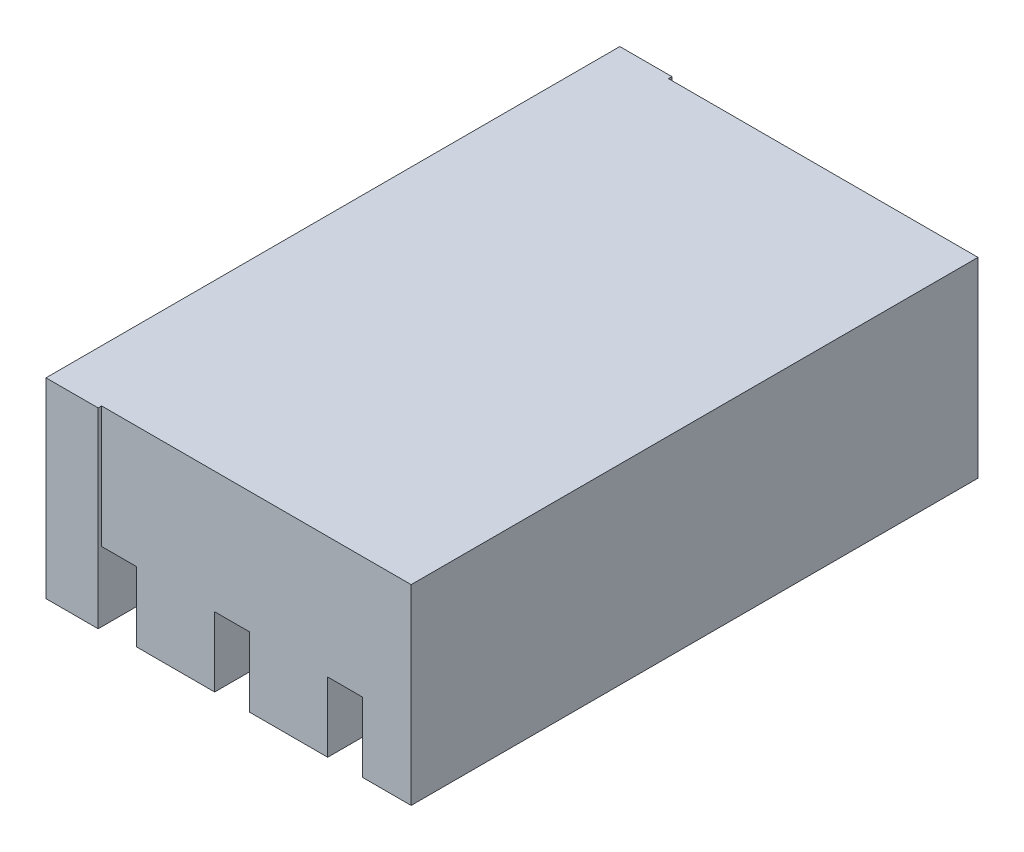
ISO-10303-21;
HEADER;
FILE_DESCRIPTION(('STEP AP214'),'2;1');
FILE_NAME('part.step','',(''),(''),'','','');
FILE_SCHEMA(('AUTOMOTIVE_DESIGN { 1 0 10303 214 1 1 1 1 }'));
ENDSEC;
DATA;
#1=APPLICATION_CONTEXT('core data for automotive mechanical design processes');
#2=APPLICATION_PROTOCOL_DEFINITION('international standard','automotive_design',2000,#1);
#3=PRODUCT_CONTEXT('',#1,'mechanical');
#4=PRODUCT('Part','Part','',(#3));
#5=PRODUCT_RELATED_PRODUCT_CATEGORY('part','',(#4));
#6=PRODUCT_DEFINITION_FORMATION('','',#4);
#7=PRODUCT_DEFINITION_CONTEXT('part definition',#1,'design');
#8=PRODUCT_DEFINITION('design','',#6,#7);
#9=PRODUCT_DEFINITION_SHAPE('','',#8);
#10=(LENGTH_UNIT() NAMED_UNIT(*) SI_UNIT(.MILLI.,.METRE.));
#11=(NAMED_UNIT(*) PLANE_ANGLE_UNIT() SI_UNIT($,.RADIAN.));
#12=(NAMED_UNIT(*) SI_UNIT($,.STERADIAN.) SOLID_ANGLE_UNIT());
#13=UNCERTAINTY_MEASURE_WITH_UNIT(LENGTH_MEASURE(1.E-05),#10,'distance_accuracy_value','');
#14=(GEOMETRIC_REPRESENTATION_CONTEXT(3) GLOBAL_UNCERTAINTY_ASSIGNED_CONTEXT((#13)) GLOBAL_UNIT_ASSIGNED_CONTEXT((#10,
#11,#12)) REPRESENTATION_CONTEXT('',''));
#15=CARTESIAN_POINT('',(0.,0.,0.));
#16=DIRECTION('',(0.,0.,1.));
#17=DIRECTION('',(1.,0.,0.));
#18=AXIS2_PLACEMENT_3D('',#15,#16,#17);
#19=CARTESIAN_POINT('',(0.,0.,0.));
#20=DIRECTION('',(0.,1.,0.));
#21=DIRECTION('',(0.,0.,1.));
#22=AXIS2_PLACEMENT_3D('',#19,#20,#21);
#23=PLANE('',#22);
#24=DIRECTION('',(1.,0.,0.));
#25=VECTOR('',#24,1.);
#26=CARTESIAN_POINT('',(0.,0.,17.8));
#27=LINE('',#26,#25);
#28=CARTESIAN_POINT('',(-5.5,0.,17.8));
#29=VERTEX_POINT('',#28);
#30=CARTESIAN_POINT('',(-1.,0.,17.8));
#31=VERTEX_POINT('',#30);
#32=EDGE_CURVE('E386',#29,#31,#27,.T.);
#33=ORIENTED_EDGE('',*,*,#32,.F.);
#34=DIRECTION('',(0.,0.,1.));
#35=VECTOR('',#34,1.);
#36=CARTESIAN_POINT('',(-5.5,0.,15.));
#37=LINE('',#36,#35);
#38=CARTESIAN_POINT('',(-5.5,0.,15.2));
#39=VERTEX_POINT('',#38);
#40=EDGE_CURVE('E167',#39,#29,#37,.T.);
#41=ORIENTED_EDGE('',*,*,#40,.F.);
#42=DIRECTION('',(-1.,0.,0.));
#43=VECTOR('',#42,1.);
#44=CARTESIAN_POINT('',(0.,0.,15.2));
#45=LINE('',#44,#43);
#46=CARTESIAN_POINT('',(-1.,0.,15.2));
#47=VERTEX_POINT('',#46);
#48=EDGE_CURVE('E284',#47,#39,#45,.T.);
#49=ORIENTED_EDGE('',*,*,#48,.F.);
#50=DIRECTION('',(0.,0.,1.));
#51=VECTOR('',#50,1.);
#52=CARTESIAN_POINT('',(-0.999999999999998,0.,0.));
#53=LINE('',#52,#51);
#54=EDGE_CURVE('E131',#47,#31,#53,.T.);
#55=ORIENTED_EDGE('',*,*,#54,.T.);
#56=EDGE_LOOP('',(#33,#41,#49,#55));
#57=FACE_BOUND('',#56,.T.);
#58=ADVANCED_FACE('F45',(#57),#23,.F.);
#59=DIRECTION('',(-1.,0.,0.));
#60=VECTOR('',#59,1.);
#61=CARTESIAN_POINT('',(0.,0.,-14.8));
#62=LINE('',#61,#60);
#63=CARTESIAN_POINT('',(10.3,0.,-14.8));
#64=VERTEX_POINT('',#63);
#65=CARTESIAN_POINT('',(7.7,0.,-14.8));
#66=VERTEX_POINT('',#65);
#67=EDGE_CURVE('E391',#64,#66,#62,.T.);
#68=ORIENTED_EDGE('',*,*,#67,.F.);
#69=DIRECTION('',(0.,0.,-1.));
#70=VECTOR('',#69,1.);
#71=CARTESIAN_POINT('',(10.3,0.,0.));
#72=LINE('',#71,#70);
#73=CARTESIAN_POINT('',(10.3,0.,17.8));
#74=VERTEX_POINT('',#73);
#75=EDGE_CURVE('E262',#74,#64,#72,.T.);
#76=ORIENTED_EDGE('',*,*,#75,.F.);
#77=DIRECTION('',(1.,0.,0.));
#78=VECTOR('',#77,1.);
#79=CARTESIAN_POINT('',(0.,0.,17.8));
#80=LINE('',#79,#78);
#81=CARTESIAN_POINT('',(7.50000000000001,0.,17.8));
#82=VERTEX_POINT('',#81);
#83=EDGE_CURVE('E259',#82,#74,#80,.T.);
#84=ORIENTED_EDGE('',*,*,#83,.F.);
#85=DIRECTION('',(0.,0.,1.));
#86=VECTOR('',#85,1.);
#87=CARTESIAN_POINT('',(7.5,0.,0.));
#88=LINE('',#87,#86);
#89=CARTESIAN_POINT('',(7.50000000000001,0.,15.2));
#90=VERTEX_POINT('',#89);
#91=EDGE_CURVE('E97',#90,#82,#88,.T.);
#92=ORIENTED_EDGE('',*,*,#91,.F.);
#93=CARTESIAN_POINT('',(7.7,0.,15.2));
#94=VERTEX_POINT('',#93);
#95=EDGE_CURVE('E256',#94,#90,#45,.T.);
#96=ORIENTED_EDGE('',*,*,#95,.F.);
#97=DIRECTION('',(0.,0.,1.));
#98=VECTOR('',#97,1.);
#99=CARTESIAN_POINT('',(7.7,0.,0.));
#100=LINE('',#99,#98);
#101=EDGE_CURVE('E273',#66,#94,#100,.T.);
#102=ORIENTED_EDGE('',*,*,#101,.F.);
#103=EDGE_LOOP('',(#68,#76,#84,#92,#96,#102));
#104=FACE_BOUND('',#103,.T.);
#105=ADVANCED_FACE('F254',(#104),#23,.F.);
#106=CARTESIAN_POINT('',(7.5,11.,0.));
#107=DIRECTION('',(1.,0.,0.));
#108=DIRECTION('',(0.,0.,-1.));
#109=AXIS2_PLACEMENT_3D('',#106,#107,#108);
#110=PLANE('',#109);
#111=DIRECTION('',(0.,-1.,0.));
#112=VECTOR('',#111,1.);
#113=CARTESIAN_POINT('',(7.50000000000001,11.,17.8));
#114=LINE('',#113,#112);
#115=CARTESIAN_POINT('',(7.5,4.,17.8));
#116=VERTEX_POINT('',#115);
#117=EDGE_CURVE('E271',#116,#82,#114,.T.);
#118=ORIENTED_EDGE('',*,*,#117,.F.);
#119=DIRECTION('',(0.,0.,1.));
#120=VECTOR('',#119,1.);
#121=CARTESIAN_POINT('',(7.5,4.,15.));
#122=LINE('',#121,#120);
#123=CARTESIAN_POINT('',(7.5,4.,15.2));
#124=VERTEX_POINT('',#123);
#125=EDGE_CURVE('E181',#124,#116,#122,.T.);
#126=ORIENTED_EDGE('',*,*,#125,.F.);
#127=DIRECTION('',(0.,-1.,0.));
#128=VECTOR('',#127,1.);
#129=CARTESIAN_POINT('',(7.50000000000001,11.,15.2));
#130=LINE('',#129,#128);
#131=EDGE_CURVE('E189',#124,#90,#130,.T.);
#132=ORIENTED_EDGE('',*,*,#131,.T.);
#133=ORIENTED_EDGE('',*,*,#91,.T.);
#134=EDGE_LOOP('',(#118,#126,#132,#133));
#135=FACE_BOUND('',#134,.T.);
#136=ADVANCED_FACE('F242',(#135),#110,.F.);
#137=CARTESIAN_POINT('',(0.,11.,18.));
#138=DIRECTION('',(0.,0.,1.));
#139=DIRECTION('',(1.,0.,0.));
#140=AXIS2_PLACEMENT_3D('',#137,#138,#139);
#141=PLANE('',#140);
#142=DIRECTION('',(0.,-1.,0.));
#143=VECTOR('',#142,1.);
#144=CARTESIAN_POINT('',(-7.5,11.,18.));
#145=LINE('',#144,#143);
#146=CARTESIAN_POINT('',(-7.5,11.,18.));
#147=VERTEX_POINT('',#146);
#148=CARTESIAN_POINT('',(-7.5,0.,18.));
#149=VERTEX_POINT('',#148);
#150=EDGE_CURVE('E159',#147,#149,#145,.T.);
#151=ORIENTED_EDGE('',*,*,#150,.F.);
#152=DIRECTION('',(-1.,0.,0.));
#153=VECTOR('',#152,1.);
#154=CARTESIAN_POINT('',(0.,11.,18.));
#155=LINE('',#154,#153);
#156=CARTESIAN_POINT('',(-10.5,11.,18.));
#157=VERTEX_POINT('',#156);
#158=EDGE_CURVE('E70',#147,#157,#155,.T.);
#159=ORIENTED_EDGE('',*,*,#158,.T.);
#160=DIRECTION('',(0.,-1.,0.));
#161=VECTOR('',#160,1.);
#162=CARTESIAN_POINT('',(-10.5,11.,18.));
#163=LINE('',#162,#161);
#164=CARTESIAN_POINT('',(-10.5,0.,18.));
#165=VERTEX_POINT('',#164);
#166=EDGE_CURVE('E100',#157,#165,#163,.T.);
#167=ORIENTED_EDGE('',*,*,#166,.T.);
#168=DIRECTION('',(-1.,0.,0.));
#169=VECTOR('',#168,1.);
#170=CARTESIAN_POINT('',(0.,0.,18.));
#171=LINE('',#170,#169);
#172=EDGE_CURVE('E88',#149,#165,#171,.T.);
#173=ORIENTED_EDGE('',*,*,#172,.F.);
#174=EDGE_LOOP('',(#151,#159,#167,#173));
#175=FACE_BOUND('',#174,.T.);
#176=ADVANCED_FACE('F101',(#175),#141,.T.);
#177=CARTESIAN_POINT('',(0.,11.,-15.));
#178=DIRECTION('',(0.,0.,-1.));
#179=DIRECTION('',(-1.,0.,0.));
#180=AXIS2_PLACEMENT_3D('',#177,#178,#179);
#181=PLANE('',#180);
#182=DIRECTION('',(-1.,0.,0.));
#183=VECTOR('',#182,1.);
#184=CARTESIAN_POINT('',(0.,11.,-15.));
#185=LINE('',#184,#183);
#186=CARTESIAN_POINT('',(-7.5,11.,-15.));
#187=VERTEX_POINT('',#186);
#188=CARTESIAN_POINT('',(-10.5,11.,-15.));
#189=VERTEX_POINT('',#188);
#190=EDGE_CURVE('E120',#187,#189,#185,.T.);
#191=ORIENTED_EDGE('',*,*,#190,.F.);
#192=DIRECTION('',(0.,-1.,0.));
#193=VECTOR('',#192,1.);
#194=CARTESIAN_POINT('',(-7.5,11.,-15.));
#195=LINE('',#194,#193);
#196=CARTESIAN_POINT('',(-7.5,0.,-15.));
#197=VERTEX_POINT('',#196);
#198=EDGE_CURVE('E124',#187,#197,#195,.T.);
#199=ORIENTED_EDGE('',*,*,#198,.T.);
#200=DIRECTION('',(-1.,0.,0.));
#201=VECTOR('',#200,1.);
#202=CARTESIAN_POINT('',(0.,0.,-15.));
#203=LINE('',#202,#201);
#204=CARTESIAN_POINT('',(-10.5,0.,-15.));
#205=VERTEX_POINT('',#204);
#206=EDGE_CURVE('E111',#197,#205,#203,.T.);
#207=ORIENTED_EDGE('',*,*,#206,.T.);
#208=DIRECTION('',(0.,-1.,0.));
#209=VECTOR('',#208,1.);
#210=CARTESIAN_POINT('',(-10.5,11.,-15.));
#211=LINE('',#210,#209);
#212=EDGE_CURVE('E105',#189,#205,#211,.T.);
#213=ORIENTED_EDGE('',*,*,#212,.F.);
#214=EDGE_LOOP('',(#191,#199,#207,#213));
#215=FACE_BOUND('',#214,.T.);
#216=ADVANCED_FACE('F484',(#215),#181,.T.);
#217=CARTESIAN_POINT('',(0.,11.,0.));
#218=DIRECTION('',(0.,1.,0.));
#219=DIRECTION('',(0.,0.,1.));
#220=AXIS2_PLACEMENT_3D('',#217,#218,#219);
#221=PLANE('',#220);
#222=ORIENTED_EDGE('',*,*,#158,.F.);
#223=DIRECTION('',(0.,0.,1.));
#224=VECTOR('',#223,1.);
#225=CARTESIAN_POINT('',(-7.5,11.,0.));
#226=LINE('',#225,#224);
#227=CARTESIAN_POINT('',(-7.49999999999999,11.,17.8));
#228=VERTEX_POINT('',#227);
#229=EDGE_CURVE('E209',#228,#147,#226,.T.);
#230=ORIENTED_EDGE('',*,*,#229,.F.);
#231=DIRECTION('',(-1.,0.,0.));
#232=VECTOR('',#231,1.);
#233=CARTESIAN_POINT('',(0.,11.,17.8));
#234=LINE('',#233,#232);
#235=CARTESIAN_POINT('',(10.3,11.,17.8));
#236=VERTEX_POINT('',#235);
#237=EDGE_CURVE('E413',#236,#228,#234,.T.);
#238=ORIENTED_EDGE('',*,*,#237,.F.);
#239=DIRECTION('',(0.,0.,1.));
#240=VECTOR('',#239,1.);
#241=CARTESIAN_POINT('',(10.3,11.,0.));
#242=LINE('',#241,#240);
#243=CARTESIAN_POINT('',(10.3,11.,-14.8));
#244=VERTEX_POINT('',#243);
#245=EDGE_CURVE('E400',#244,#236,#242,.T.);
#246=ORIENTED_EDGE('',*,*,#245,.F.);
#247=DIRECTION('',(1.,0.,0.));
#248=VECTOR('',#247,1.);
#249=CARTESIAN_POINT('',(0.,11.,-14.8));
#250=LINE('',#249,#248);
#251=CARTESIAN_POINT('',(-7.5,11.,-14.8));
#252=VERTEX_POINT('',#251);
#253=EDGE_CURVE('E210',#252,#244,#250,.T.);
#254=ORIENTED_EDGE('',*,*,#253,.F.);
#255=EDGE_CURVE('E207',#187,#252,#226,.T.);
#256=ORIENTED_EDGE('',*,*,#255,.F.);
#257=ORIENTED_EDGE('',*,*,#190,.T.);
#258=DIRECTION('',(0.,0.,1.));
#259=VECTOR('',#258,1.);
#260=CARTESIAN_POINT('',(-10.5,11.,0.));
#261=LINE('',#260,#259);
#262=EDGE_CURVE('E198',#189,#157,#261,.T.);
#263=ORIENTED_EDGE('',*,*,#262,.T.);
#264=EDGE_LOOP('',(#222,#230,#238,#246,#254,#256,#257,#263));
#265=FACE_BOUND('',#264,.T.);
#266=ADVANCED_FACE('F437',(#265),#221,.T.);
#267=DIRECTION('',(1.,0.,0.));
#268=VECTOR('',#267,1.);
#269=CARTESIAN_POINT('',(0.,0.,17.8));
#270=LINE('',#269,#268);
#271=CARTESIAN_POINT('',(1.,0.,17.8));
#272=VERTEX_POINT('',#271);
#273=CARTESIAN_POINT('',(5.5,0.,17.8));
#274=VERTEX_POINT('',#273);
#275=EDGE_CURVE('E334',#272,#274,#270,.T.);
#276=ORIENTED_EDGE('',*,*,#275,.F.);
#277=DIRECTION('',(0.,0.,1.));
#278=VECTOR('',#277,1.);
#279=CARTESIAN_POINT('',(0.999999999999999,0.,23.3855915472522));
#280=LINE('',#279,#278);
#281=CARTESIAN_POINT('',(1.,0.,15.2));
#282=VERTEX_POINT('',#281);
#283=EDGE_CURVE('E173',#282,#272,#280,.T.);
#284=ORIENTED_EDGE('',*,*,#283,.F.);
#285=CARTESIAN_POINT('',(5.5,0.,15.2));
#286=VERTEX_POINT('',#285);
#287=EDGE_CURVE('E283',#286,#282,#45,.T.);
#288=ORIENTED_EDGE('',*,*,#287,.F.);
#289=DIRECTION('',(0.,0.,1.));
#290=VECTOR('',#289,1.);
#291=CARTESIAN_POINT('',(5.5,0.,0.));
#292=LINE('',#291,#290);
#293=EDGE_CURVE('E127',#286,#274,#292,.T.);
#294=ORIENTED_EDGE('',*,*,#293,.T.);
#295=EDGE_LOOP('',(#276,#284,#288,#294));
#296=FACE_BOUND('',#295,.T.);
#297=ADVANCED_FACE('F369',(#296),#23,.F.);
#298=CARTESIAN_POINT('',(0.,8.,0.));
#299=DIRECTION('',(0.,1.,0.));
#300=DIRECTION('',(0.,0.,1.));
#301=AXIS2_PLACEMENT_3D('',#298,#299,#300);
#302=PLANE('',#301);
#303=DIRECTION('',(0.,0.,1.));
#304=VECTOR('',#303,1.);
#305=CARTESIAN_POINT('',(-7.5,8.,0.));
#306=LINE('',#305,#304);
#307=CARTESIAN_POINT('',(-7.5,8.,-14.8));
#308=VERTEX_POINT('',#307);
#309=CARTESIAN_POINT('',(-7.49999999999999,8.,15.2));
#310=VERTEX_POINT('',#309);
#311=EDGE_CURVE('E164',#308,#310,#306,.T.);
#312=ORIENTED_EDGE('',*,*,#311,.F.);
#313=DIRECTION('',(1.,0.,0.));
#314=VECTOR('',#313,1.);
#315=CARTESIAN_POINT('',(0.,8.,-14.8));
#316=LINE('',#315,#314);
#317=CARTESIAN_POINT('',(7.7,8.,-14.8));
#318=VERTEX_POINT('',#317);
#319=EDGE_CURVE('E282',#308,#318,#316,.T.);
#320=ORIENTED_EDGE('',*,*,#319,.T.);
#321=DIRECTION('',(0.,0.,1.));
#322=VECTOR('',#321,1.);
#323=CARTESIAN_POINT('',(7.7,8.,0.));
#324=LINE('',#323,#322);
#325=CARTESIAN_POINT('',(7.7,8.,15.2));
#326=VERTEX_POINT('',#325);
#327=EDGE_CURVE('E297',#318,#326,#324,.T.);
#328=ORIENTED_EDGE('',*,*,#327,.T.);
#329=DIRECTION('',(-1.,0.,0.));
#330=VECTOR('',#329,1.);
#331=CARTESIAN_POINT('',(0.,8.,15.2));
#332=LINE('',#331,#330);
#333=EDGE_CURVE('E292',#326,#310,#332,.T.);
#334=ORIENTED_EDGE('',*,*,#333,.T.);
#335=EDGE_LOOP('',(#312,#320,#328,#334));
#336=FACE_BOUND('',#335,.T.);
#337=ADVANCED_FACE('F476',(#336),#302,.F.);
#338=CARTESIAN_POINT('',(5.5,4.,15.));
#339=DIRECTION('',(-1.,0.,0.));
#340=DIRECTION('',(0.,0.,1.));
#341=AXIS2_PLACEMENT_3D('',#338,#339,#340);
#342=PLANE('',#341);
#343=DIRECTION('',(0.,1.,0.));
#344=VECTOR('',#343,1.);
#345=CARTESIAN_POINT('',(5.5,4.,17.8));
#346=LINE('',#345,#344);
#347=CARTESIAN_POINT('',(5.5,4.,17.8));
#348=VERTEX_POINT('',#347);
#349=EDGE_CURVE('E338',#274,#348,#346,.T.);
#350=ORIENTED_EDGE('',*,*,#349,.F.);
#351=ORIENTED_EDGE('',*,*,#293,.F.);
#352=DIRECTION('',(0.,1.,0.));
#353=VECTOR('',#352,1.);
#354=CARTESIAN_POINT('',(5.5,4.,15.2));
#355=LINE('',#354,#353);
#356=CARTESIAN_POINT('',(5.5,4.,15.2));
#357=VERTEX_POINT('',#356);
#358=EDGE_CURVE('E223',#286,#357,#355,.T.);
#359=ORIENTED_EDGE('',*,*,#358,.T.);
#360=DIRECTION('',(0.,0.,-1.));
#361=VECTOR('',#360,1.);
#362=CARTESIAN_POINT('',(5.5,4.,15.));
#363=LINE('',#362,#361);
#364=EDGE_CURVE('E185',#348,#357,#363,.T.);
#365=ORIENTED_EDGE('',*,*,#364,.F.);
#366=EDGE_LOOP('',(#350,#351,#359,#365));
#367=FACE_BOUND('',#366,.T.);
#368=ADVANCED_FACE('F360',(#367),#342,.F.);
#369=CARTESIAN_POINT('',(0.,4.,0.));
#370=DIRECTION('',(0.,-1.,0.));
#371=DIRECTION('',(0.,0.,-1.));
#372=AXIS2_PLACEMENT_3D('',#369,#370,#371);
#373=PLANE('',#372);
#374=ORIENTED_EDGE('',*,*,#125,.T.);
#375=DIRECTION('',(-1.,0.,0.));
#376=VECTOR('',#375,1.);
#377=CARTESIAN_POINT('',(0.,4.,17.8));
#378=LINE('',#377,#376);
#379=EDGE_CURVE('E276',#116,#348,#378,.T.);
#380=ORIENTED_EDGE('',*,*,#379,.T.);
#381=ORIENTED_EDGE('',*,*,#364,.T.);
#382=DIRECTION('',(-1.,0.,0.));
#383=VECTOR('',#382,1.);
#384=CARTESIAN_POINT('',(0.,4.,15.2));
#385=LINE('',#384,#383);
#386=EDGE_CURVE('E215',#124,#357,#385,.T.);
#387=ORIENTED_EDGE('',*,*,#386,.F.);
#388=EDGE_LOOP('',(#374,#380,#381,#387));
#389=FACE_BOUND('',#388,.T.);
#390=ADVANCED_FACE('F354',(#389),#373,.T.);
#391=CARTESIAN_POINT('',(-1.,4.,23.3855915472522));
#392=DIRECTION('',(-1.,0.,0.));
#393=DIRECTION('',(0.,0.,1.));
#394=AXIS2_PLACEMENT_3D('',#391,#392,#393);
#395=PLANE('',#394);
#396=DIRECTION('',(0.,1.,0.));
#397=VECTOR('',#396,1.);
#398=CARTESIAN_POINT('',(-1.,4.,17.8));
#399=LINE('',#398,#397);
#400=CARTESIAN_POINT('',(-1.,4.,17.8));
#401=VERTEX_POINT('',#400);
#402=EDGE_CURVE('E341',#31,#401,#399,.T.);
#403=ORIENTED_EDGE('',*,*,#402,.F.);
#404=ORIENTED_EDGE('',*,*,#54,.F.);
#405=DIRECTION('',(0.,1.,0.));
#406=VECTOR('',#405,1.);
#407=CARTESIAN_POINT('',(-1.,4.,15.2));
#408=LINE('',#407,#406);
#409=CARTESIAN_POINT('',(-1.,4.,15.2));
#410=VERTEX_POINT('',#409);
#411=EDGE_CURVE('E213',#47,#410,#408,.T.);
#412=ORIENTED_EDGE('',*,*,#411,.T.);
#413=DIRECTION('',(0.,0.,-1.));
#414=VECTOR('',#413,1.);
#415=CARTESIAN_POINT('',(-1.,4.,23.3855915472522));
#416=LINE('',#415,#414);
#417=EDGE_CURVE('E177',#401,#410,#416,.T.);
#418=ORIENTED_EDGE('',*,*,#417,.F.);
#419=EDGE_LOOP('',(#403,#404,#412,#418));
#420=FACE_BOUND('',#419,.T.);
#421=ADVANCED_FACE('F380',(#420),#395,.F.);
#422=CARTESIAN_POINT('',(0.999999999999999,4.,23.3855915472522));
#423=DIRECTION('',(1.,0.,0.));
#424=DIRECTION('',(0.,0.,-1.));
#425=AXIS2_PLACEMENT_3D('',#422,#423,#424);
#426=PLANE('',#425);
#427=DIRECTION('',(0.,-1.,0.));
#428=VECTOR('',#427,1.);
#429=CARTESIAN_POINT('',(1.,4.,17.8));
#430=LINE('',#429,#428);
#431=CARTESIAN_POINT('',(1.,4.,17.8));
#432=VERTEX_POINT('',#431);
#433=EDGE_CURVE('E327',#432,#272,#430,.T.);
#434=ORIENTED_EDGE('',*,*,#433,.F.);
#435=DIRECTION('',(0.,0.,1.));
#436=VECTOR('',#435,1.);
#437=CARTESIAN_POINT('',(0.999999999999999,4.,23.3855915472522));
#438=LINE('',#437,#436);
#439=CARTESIAN_POINT('',(1.,4.,15.2));
#440=VERTEX_POINT('',#439);
#441=EDGE_CURVE('E178',#440,#432,#438,.T.);
#442=ORIENTED_EDGE('',*,*,#441,.F.);
#443=DIRECTION('',(0.,-1.,0.));
#444=VECTOR('',#443,1.);
#445=CARTESIAN_POINT('',(1.,4.,15.2));
#446=LINE('',#445,#444);
#447=EDGE_CURVE('E216',#440,#282,#446,.T.);
#448=ORIENTED_EDGE('',*,*,#447,.T.);
#449=ORIENTED_EDGE('',*,*,#283,.T.);
#450=EDGE_LOOP('',(#434,#442,#448,#449));
#451=FACE_BOUND('',#450,.T.);
#452=ADVANCED_FACE('F323',(#451),#426,.F.);
#453=CARTESIAN_POINT('',(0.,4.,0.));
#454=DIRECTION('',(0.,1.,0.));
#455=DIRECTION('',(0.,0.,1.));
#456=AXIS2_PLACEMENT_3D('',#453,#454,#455);
#457=PLANE('',#456);
#458=DIRECTION('',(1.,0.,0.));
#459=VECTOR('',#458,1.);
#460=CARTESIAN_POINT('',(0.,4.,17.8));
#461=LINE('',#460,#459);
#462=EDGE_CURVE('E335',#401,#432,#461,.T.);
#463=ORIENTED_EDGE('',*,*,#462,.F.);
#464=ORIENTED_EDGE('',*,*,#417,.T.);
#465=DIRECTION('',(1.,0.,0.));
#466=VECTOR('',#465,1.);
#467=CARTESIAN_POINT('',(0.,4.,15.2));
#468=LINE('',#467,#466);
#469=EDGE_CURVE('E227',#410,#440,#468,.T.);
#470=ORIENTED_EDGE('',*,*,#469,.T.);
#471=ORIENTED_EDGE('',*,*,#441,.T.);
#472=EDGE_LOOP('',(#463,#464,#470,#471));
#473=FACE_BOUND('',#472,.T.);
#474=ADVANCED_FACE('F317',(#473),#457,.F.);
#475=CARTESIAN_POINT('',(-5.5,4.,15.));
#476=DIRECTION('',(1.,0.,0.));
#477=DIRECTION('',(0.,0.,-1.));
#478=AXIS2_PLACEMENT_3D('',#475,#476,#477);
#479=PLANE('',#478);
#480=DIRECTION('',(0.,-1.,0.));
#481=VECTOR('',#480,1.);
#482=CARTESIAN_POINT('',(-5.5,4.,17.8));
#483=LINE('',#482,#481);
#484=CARTESIAN_POINT('',(-5.5,4.,17.8));
#485=VERTEX_POINT('',#484);
#486=EDGE_CURVE('E157',#485,#29,#483,.T.);
#487=ORIENTED_EDGE('',*,*,#486,.F.);
#488=DIRECTION('',(0.,0.,1.));
#489=VECTOR('',#488,1.);
#490=CARTESIAN_POINT('',(-5.5,4.,15.));
#491=LINE('',#490,#489);
#492=CARTESIAN_POINT('',(-5.5,4.,15.2));
#493=VERTEX_POINT('',#492);
#494=EDGE_CURVE('E142',#493,#485,#491,.T.);
#495=ORIENTED_EDGE('',*,*,#494,.F.);
#496=DIRECTION('',(0.,-1.,0.));
#497=VECTOR('',#496,1.);
#498=CARTESIAN_POINT('',(-5.5,4.,15.2));
#499=LINE('',#498,#497);
#500=EDGE_CURVE('E154',#493,#39,#499,.T.);
#501=ORIENTED_EDGE('',*,*,#500,.T.);
#502=ORIENTED_EDGE('',*,*,#40,.T.);
#503=EDGE_LOOP('',(#487,#495,#501,#502));
#504=FACE_BOUND('',#503,.T.);
#505=ADVANCED_FACE('F152',(#504),#479,.F.);
#506=CARTESIAN_POINT('',(0.,4.,0.));
#507=DIRECTION('',(0.,1.,0.));
#508=DIRECTION('',(0.,0.,1.));
#509=AXIS2_PLACEMENT_3D('',#506,#507,#508);
#510=PLANE('',#509);
#511=DIRECTION('',(1.,0.,0.));
#512=VECTOR('',#511,1.);
#513=CARTESIAN_POINT('',(0.,4.,17.8));
#514=LINE('',#513,#512);
#515=CARTESIAN_POINT('',(-7.49999999999999,4.,17.8));
#516=VERTEX_POINT('',#515);
#517=EDGE_CURVE('E12',#516,#485,#514,.T.);
#518=ORIENTED_EDGE('',*,*,#517,.F.);
#519=DIRECTION('',(0.,0.,-1.));
#520=VECTOR('',#519,1.);
#521=CARTESIAN_POINT('',(-7.5,4.,15.));
#522=LINE('',#521,#520);
#523=CARTESIAN_POINT('',(-7.5,4.,15.2));
#524=VERTEX_POINT('',#523);
#525=EDGE_CURVE('E61',#516,#524,#522,.T.);
#526=ORIENTED_EDGE('',*,*,#525,.T.);
#527=DIRECTION('',(1.,0.,0.));
#528=VECTOR('',#527,1.);
#529=CARTESIAN_POINT('',(0.,4.,15.2));
#530=LINE('',#529,#528);
#531=EDGE_CURVE('E54',#524,#493,#530,.T.);
#532=ORIENTED_EDGE('',*,*,#531,.T.);
#533=ORIENTED_EDGE('',*,*,#494,.T.);
#534=EDGE_LOOP('',(#518,#526,#532,#533));
#535=FACE_BOUND('',#534,.T.);
#536=ADVANCED_FACE('F140',(#535),#510,.F.);
#537=DIRECTION('',(0.,0.,1.));
#538=VECTOR('',#537,1.);
#539=CARTESIAN_POINT('',(-7.5,0.,0.));
#540=LINE('',#539,#538);
#541=EDGE_CURVE('E94',#197,#149,#540,.T.);
#542=ORIENTED_EDGE('',*,*,#541,.T.);
#543=ORIENTED_EDGE('',*,*,#172,.T.);
#544=DIRECTION('',(0.,0.,1.));
#545=VECTOR('',#544,1.);
#546=CARTESIAN_POINT('',(-10.5,0.,0.));
#547=LINE('',#546,#545);
#548=EDGE_CURVE('E92',#205,#165,#547,.T.);
#549=ORIENTED_EDGE('',*,*,#548,.F.);
#550=ORIENTED_EDGE('',*,*,#206,.F.);
#551=EDGE_LOOP('',(#542,#543,#549,#550));
#552=FACE_BOUND('',#551,.T.);
#553=ADVANCED_FACE('F89',(#552),#23,.F.);
#554=CARTESIAN_POINT('',(-7.5,11.,0.));
#555=DIRECTION('',(1.,0.,0.));
#556=DIRECTION('',(0.,0.,-1.));
#557=AXIS2_PLACEMENT_3D('',#554,#555,#556);
#558=PLANE('',#557);
#559=ORIENTED_EDGE('',*,*,#150,.T.);
#560=ORIENTED_EDGE('',*,*,#541,.F.);
#561=ORIENTED_EDGE('',*,*,#198,.F.);
#562=ORIENTED_EDGE('',*,*,#255,.T.);
#563=DIRECTION('',(0.,-1.,0.));
#564=VECTOR('',#563,1.);
#565=CARTESIAN_POINT('',(-7.5,11.,-14.8));
#566=LINE('',#565,#564);
#567=EDGE_CURVE('E395',#252,#308,#566,.T.);
#568=ORIENTED_EDGE('',*,*,#567,.T.);
#569=ORIENTED_EDGE('',*,*,#311,.T.);
#570=DIRECTION('',(0.,-1.,0.));
#571=VECTOR('',#570,1.);
#572=CARTESIAN_POINT('',(-7.49999999999999,41.6309381373758,15.2));
#573=LINE('',#572,#571);
#574=EDGE_CURVE('E205',#310,#524,#573,.T.);
#575=ORIENTED_EDGE('',*,*,#574,.T.);
#576=ORIENTED_EDGE('',*,*,#525,.F.);
#577=DIRECTION('',(0.,-1.,0.));
#578=VECTOR('',#577,1.);
#579=CARTESIAN_POINT('',(-7.49999999999999,11.,17.8));
#580=LINE('',#579,#578);
#581=EDGE_CURVE('E399',#228,#516,#580,.T.);
#582=ORIENTED_EDGE('',*,*,#581,.F.);
#583=ORIENTED_EDGE('',*,*,#229,.T.);
#584=EDGE_LOOP('',(#559,#560,#561,#562,#568,#569,#575,#576,#582,#583));
#585=FACE_BOUND('',#584,.T.);
#586=ADVANCED_FACE('F47',(#585),#558,.T.);
#587=CARTESIAN_POINT('',(-10.5,11.,0.));
#588=DIRECTION('',(1.,0.,0.));
#589=DIRECTION('',(0.,0.,-1.));
#590=AXIS2_PLACEMENT_3D('',#587,#588,#589);
#591=PLANE('',#590);
#592=ORIENTED_EDGE('',*,*,#212,.T.);
#593=ORIENTED_EDGE('',*,*,#548,.T.);
#594=ORIENTED_EDGE('',*,*,#166,.F.);
#595=ORIENTED_EDGE('',*,*,#262,.F.);
#596=EDGE_LOOP('',(#592,#593,#594,#595));
#597=FACE_BOUND('',#596,.T.);
#598=ADVANCED_FACE('F107',(#597),#591,.F.);
#599=CARTESIAN_POINT('',(0.,41.6309381373758,15.2));
#600=DIRECTION('',(0.,0.,1.));
#601=DIRECTION('',(1.,0.,0.));
#602=AXIS2_PLACEMENT_3D('',#599,#600,#601);
#603=PLANE('',#602);
#604=ORIENTED_EDGE('',*,*,#386,.T.);
#605=ORIENTED_EDGE('',*,*,#358,.F.);
#606=ORIENTED_EDGE('',*,*,#287,.T.);
#607=ORIENTED_EDGE('',*,*,#447,.F.);
#608=ORIENTED_EDGE('',*,*,#469,.F.);
#609=ORIENTED_EDGE('',*,*,#411,.F.);
#610=ORIENTED_EDGE('',*,*,#48,.T.);
#611=ORIENTED_EDGE('',*,*,#500,.F.);
#612=ORIENTED_EDGE('',*,*,#531,.F.);
#613=ORIENTED_EDGE('',*,*,#574,.F.);
#614=ORIENTED_EDGE('',*,*,#333,.F.);
#615=DIRECTION('',(0.,-1.,0.));
#616=VECTOR('',#615,1.);
#617=CARTESIAN_POINT('',(7.7,41.6309381373758,15.2));
#618=LINE('',#617,#616);
#619=EDGE_CURVE('E296',#326,#94,#618,.T.);
#620=ORIENTED_EDGE('',*,*,#619,.T.);
#621=ORIENTED_EDGE('',*,*,#95,.T.);
#622=ORIENTED_EDGE('',*,*,#131,.F.);
#623=EDGE_LOOP('',(#604,#605,#606,#607,#608,#609,#610,#611,#612,#613,#614,#620,#621,#622));
#624=FACE_BOUND('',#623,.T.);
#625=ADVANCED_FACE('F366',(#624),#603,.F.);
#626=CARTESIAN_POINT('',(7.7,41.6309381373758,0.));
#627=DIRECTION('',(1.,0.,0.));
#628=DIRECTION('',(0.,0.,-1.));
#629=AXIS2_PLACEMENT_3D('',#626,#627,#628);
#630=PLANE('',#629);
#631=DIRECTION('',(0.,-1.,0.));
#632=VECTOR('',#631,1.);
#633=CARTESIAN_POINT('',(7.7,41.6309381373758,-14.8));
#634=LINE('',#633,#632);
#635=EDGE_CURVE('E291',#318,#66,#634,.T.);
#636=ORIENTED_EDGE('',*,*,#635,.T.);
#637=ORIENTED_EDGE('',*,*,#101,.T.);
#638=ORIENTED_EDGE('',*,*,#619,.F.);
#639=ORIENTED_EDGE('',*,*,#327,.F.);
#640=EDGE_LOOP('',(#636,#637,#638,#639));
#641=FACE_BOUND('',#640,.T.);
#642=ADVANCED_FACE('F475',(#641),#630,.F.);
#643=CARTESIAN_POINT('',(10.3,11.,0.));
#644=DIRECTION('',(1.,0.,0.));
#645=DIRECTION('',(0.,0.,-1.));
#646=AXIS2_PLACEMENT_3D('',#643,#644,#645);
#647=PLANE('',#646);
#648=ORIENTED_EDGE('',*,*,#75,.T.);
#649=DIRECTION('',(0.,-1.,0.));
#650=VECTOR('',#649,1.);
#651=CARTESIAN_POINT('',(10.3,11.,-14.8));
#652=LINE('',#651,#650);
#653=EDGE_CURVE('E394',#244,#64,#652,.T.);
#654=ORIENTED_EDGE('',*,*,#653,.F.);
#655=ORIENTED_EDGE('',*,*,#245,.T.);
#656=DIRECTION('',(0.,-1.,0.));
#657=VECTOR('',#656,1.);
#658=CARTESIAN_POINT('',(10.3,11.,17.8));
#659=LINE('',#658,#657);
#660=EDGE_CURVE('E404',#236,#74,#659,.T.);
#661=ORIENTED_EDGE('',*,*,#660,.T.);
#662=EDGE_LOOP('',(#648,#654,#655,#661));
#663=FACE_BOUND('',#662,.T.);
#664=ADVANCED_FACE('F435',(#663),#647,.T.);
#665=CARTESIAN_POINT('',(0.,11.,17.8));
#666=DIRECTION('',(0.,0.,1.));
#667=DIRECTION('',(1.,0.,0.));
#668=AXIS2_PLACEMENT_3D('',#665,#666,#667);
#669=PLANE('',#668);
#670=ORIENTED_EDGE('',*,*,#83,.T.);
#671=ORIENTED_EDGE('',*,*,#660,.F.);
#672=ORIENTED_EDGE('',*,*,#237,.T.);
#673=ORIENTED_EDGE('',*,*,#581,.T.);
#674=ORIENTED_EDGE('',*,*,#517,.T.);
#675=ORIENTED_EDGE('',*,*,#486,.T.);
#676=ORIENTED_EDGE('',*,*,#32,.T.);
#677=ORIENTED_EDGE('',*,*,#402,.T.);
#678=ORIENTED_EDGE('',*,*,#462,.T.);
#679=ORIENTED_EDGE('',*,*,#433,.T.);
#680=ORIENTED_EDGE('',*,*,#275,.T.);
#681=ORIENTED_EDGE('',*,*,#349,.T.);
#682=ORIENTED_EDGE('',*,*,#379,.F.);
#683=ORIENTED_EDGE('',*,*,#117,.T.);
#684=EDGE_LOOP('',(#670,#671,#672,#673,#674,#675,#676,#677,#678,#679,#680,#681,#682,#683));
#685=FACE_BOUND('',#684,.T.);
#686=ADVANCED_FACE('F443',(#685),#669,.T.);
#687=CARTESIAN_POINT('',(0.,11.,-14.8));
#688=DIRECTION('',(0.,0.,-1.));
#689=DIRECTION('',(-1.,0.,0.));
#690=AXIS2_PLACEMENT_3D('',#687,#688,#689);
#691=PLANE('',#690);
#692=ORIENTED_EDGE('',*,*,#67,.T.);
#693=ORIENTED_EDGE('',*,*,#635,.F.);
#694=ORIENTED_EDGE('',*,*,#319,.F.);
#695=ORIENTED_EDGE('',*,*,#567,.F.);
#696=ORIENTED_EDGE('',*,*,#253,.T.);
#697=ORIENTED_EDGE('',*,*,#653,.T.);
#698=EDGE_LOOP('',(#692,#693,#694,#695,#696,#697));
#699=FACE_BOUND('',#698,.T.);
#700=ADVANCED_FACE('F424',(#699),#691,.T.);
#701=CLOSED_SHELL('',(#58,#105,#136,#176,#216,#266,#297,#337,#368,#390,#421,#452,#474,#505,#536,
#553,#586,#598,#625,#642,#664,#686,#700));
#702=MANIFOLD_SOLID_BREP('B2',#701);
#703=ADVANCED_BREP_SHAPE_REPRESENTATION('',(#18,#702),#14);
#704=SHAPE_DEFINITION_REPRESENTATION(#9,#703);
ENDSEC;
END-ISO-10303-21;
